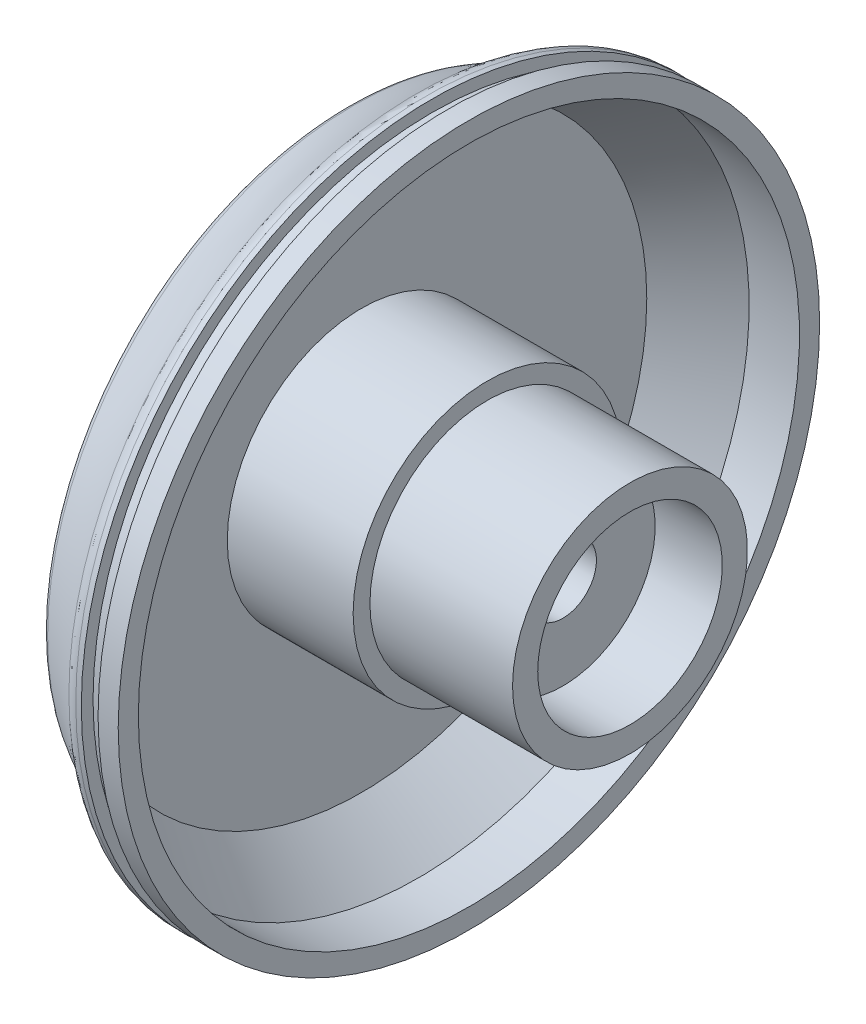
ISO-10303-21;
HEADER;
FILE_DESCRIPTION(('STEP AP214'),'2;1');
FILE_NAME('part.step','',(''),(''),'','','');
FILE_SCHEMA(('AUTOMOTIVE_DESIGN { 1 0 10303 214 1 1 1 1 }'));
ENDSEC;
DATA;
#1=APPLICATION_CONTEXT('core data for automotive mechanical design processes');
#2=APPLICATION_PROTOCOL_DEFINITION('international standard','automotive_design',2000,#1);
#3=PRODUCT_CONTEXT('',#1,'mechanical');
#4=PRODUCT('Part','Part','',(#3));
#5=PRODUCT_RELATED_PRODUCT_CATEGORY('part','',(#4));
#6=PRODUCT_DEFINITION_FORMATION('','',#4);
#7=PRODUCT_DEFINITION_CONTEXT('part definition',#1,'design');
#8=PRODUCT_DEFINITION('design','',#6,#7);
#9=PRODUCT_DEFINITION_SHAPE('','',#8);
#10=(LENGTH_UNIT() NAMED_UNIT(*) SI_UNIT(.MILLI.,.METRE.));
#11=(NAMED_UNIT(*) PLANE_ANGLE_UNIT() SI_UNIT($,.RADIAN.));
#12=(NAMED_UNIT(*) SI_UNIT($,.STERADIAN.) SOLID_ANGLE_UNIT());
#13=UNCERTAINTY_MEASURE_WITH_UNIT(LENGTH_MEASURE(1.E-05),#10,'distance_accuracy_value','');
#14=(GEOMETRIC_REPRESENTATION_CONTEXT(3) GLOBAL_UNCERTAINTY_ASSIGNED_CONTEXT((#13)) GLOBAL_UNIT_ASSIGNED_CONTEXT((#10,
#11,#12)) REPRESENTATION_CONTEXT('',''));
#15=CARTESIAN_POINT('',(0.,0.,0.));
#16=DIRECTION('',(0.,0.,1.));
#17=DIRECTION('',(1.,0.,0.));
#18=AXIS2_PLACEMENT_3D('',#15,#16,#17);
#19=CARTESIAN_POINT('',(170.,70.,0.));
#20=DIRECTION('',(-1.,0.,0.));
#21=DIRECTION('',(0.,0.,1.));
#22=AXIS2_PLACEMENT_3D('',#19,#20,#21);
#23=PLANE('',#22);
#24=CARTESIAN_POINT('',(170.,0.,0.));
#25=DIRECTION('',(-1.,0.,0.));
#26=DIRECTION('',(0.,0.,1.));
#27=AXIS2_PLACEMENT_3D('',#24,#25,#26);
#28=CIRCLE('',#27,70.);
#29=CARTESIAN_POINT('',(170.,0.,70.));
#30=VERTEX_POINT('',#29);
#31=EDGE_CURVE('E51',#30,#30,#28,.T.);
#32=ORIENTED_EDGE('',*,*,#31,.F.);
#33=EDGE_LOOP('',(#32));
#34=FACE_BOUND('',#33,.T.);
#35=CARTESIAN_POINT('',(170.,0.,0.));
#36=DIRECTION('',(-1.,0.,0.));
#37=DIRECTION('',(0.,0.,1.));
#38=AXIS2_PLACEMENT_3D('',#35,#36,#37);
#39=CIRCLE('',#38,55.);
#40=CARTESIAN_POINT('',(170.,0.,55.));
#41=VERTEX_POINT('',#40);
#42=EDGE_CURVE('E102',#41,#41,#39,.T.);
#43=ORIENTED_EDGE('',*,*,#42,.T.);
#44=EDGE_LOOP('',(#43));
#45=FACE_BOUND('',#44,.T.);
#46=ADVANCED_FACE('F31',(#34,#45),#23,.F.);
#47=CARTESIAN_POINT('',(0.,0.,0.));
#48=DIRECTION('',(-1.,0.,0.));
#49=DIRECTION('',(0.,0.,1.));
#50=AXIS2_PLACEMENT_3D('',#47,#48,#49);
#51=CYLINDRICAL_SURFACE('',#50,70.);
#52=CARTESIAN_POINT('',(85.,0.,0.));
#53=DIRECTION('',(-1.,0.,0.));
#54=DIRECTION('',(0.,0.,1.));
#55=AXIS2_PLACEMENT_3D('',#52,#53,#54);
#56=CIRCLE('',#55,70.);
#57=CARTESIAN_POINT('',(85.,0.,70.));
#58=VERTEX_POINT('',#57);
#59=EDGE_CURVE('E54',#58,#58,#56,.T.);
#60=ORIENTED_EDGE('',*,*,#59,.F.);
#61=EDGE_LOOP('',(#60));
#62=FACE_BOUND('',#61,.T.);
#63=ORIENTED_EDGE('',*,*,#31,.T.);
#64=EDGE_LOOP('',(#63));
#65=FACE_BOUND('',#64,.T.);
#66=ADVANCED_FACE('F149',(#62,#65),#51,.T.);
#67=CARTESIAN_POINT('',(85.,80.,0.));
#68=DIRECTION('',(-1.,0.,0.));
#69=DIRECTION('',(0.,0.,1.));
#70=AXIS2_PLACEMENT_3D('',#67,#68,#69);
#71=PLANE('',#70);
#72=CARTESIAN_POINT('',(85.,0.,0.));
#73=DIRECTION('',(-1.,0.,0.));
#74=DIRECTION('',(0.,0.,1.));
#75=AXIS2_PLACEMENT_3D('',#72,#73,#74);
#76=CIRCLE('',#75,80.);
#77=CARTESIAN_POINT('',(85.,0.,80.));
#78=VERTEX_POINT('',#77);
#79=EDGE_CURVE('E57',#78,#78,#76,.T.);
#80=ORIENTED_EDGE('',*,*,#79,.F.);
#81=EDGE_LOOP('',(#80));
#82=FACE_BOUND('',#81,.T.);
#83=ORIENTED_EDGE('',*,*,#59,.T.);
#84=EDGE_LOOP('',(#83));
#85=FACE_BOUND('',#84,.T.);
#86=ADVANCED_FACE('F155',(#82,#85),#71,.F.);
#87=CARTESIAN_POINT('',(0.,0.,0.));
#88=DIRECTION('',(-1.,0.,0.));
#89=DIRECTION('',(0.,0.,1.));
#90=AXIS2_PLACEMENT_3D('',#87,#88,#89);
#91=CYLINDRICAL_SURFACE('',#90,80.);
#92=CARTESIAN_POINT('',(10.,0.,0.));
#93=DIRECTION('',(-1.,0.,0.));
#94=DIRECTION('',(0.,0.,1.));
#95=AXIS2_PLACEMENT_3D('',#92,#93,#94);
#96=CIRCLE('',#95,80.);
#97=CARTESIAN_POINT('',(10.,0.,80.));
#98=VERTEX_POINT('',#97);
#99=EDGE_CURVE('E60',#98,#98,#96,.T.);
#100=ORIENTED_EDGE('',*,*,#99,.F.);
#101=EDGE_LOOP('',(#100));
#102=FACE_BOUND('',#101,.T.);
#103=ORIENTED_EDGE('',*,*,#79,.T.);
#104=EDGE_LOOP('',(#103));
#105=FACE_BOUND('',#104,.T.);
#106=ADVANCED_FACE('F305',(#102,#105),#91,.T.);
#107=CARTESIAN_POINT('',(10.,170.,0.));
#108=DIRECTION('',(-1.,0.,0.));
#109=DIRECTION('',(0.,0.,1.));
#110=AXIS2_PLACEMENT_3D('',#107,#108,#109);
#111=PLANE('',#110);
#112=CARTESIAN_POINT('',(9.99999999999999,0.,0.));
#113=DIRECTION('',(-1.,0.,0.));
#114=DIRECTION('',(0.,0.,1.));
#115=AXIS2_PLACEMENT_3D('',#112,#113,#114);
#116=CIRCLE('',#115,170.);
#117=CARTESIAN_POINT('',(9.99999999999999,0.,170.));
#118=VERTEX_POINT('',#117);
#119=EDGE_CURVE('E63',#118,#118,#116,.T.);
#120=ORIENTED_EDGE('',*,*,#119,.F.);
#121=EDGE_LOOP('',(#120));
#122=FACE_BOUND('',#121,.T.);
#123=ORIENTED_EDGE('',*,*,#99,.T.);
#124=EDGE_LOOP('',(#123));
#125=FACE_BOUND('',#124,.T.);
#126=ADVANCED_FACE('F295',(#122,#125),#111,.F.);
#127=CARTESIAN_POINT('',(9.99999999999999,0.,0.));
#128=DIRECTION('',(1.,0.,0.));
#129=DIRECTION('',(0.,0.,-1.));
#130=AXIS2_PLACEMENT_3D('',#127,#128,#129);
#131=CONICAL_SURFACE('',#130,170.,0.671143835436008);
#132=CARTESIAN_POINT('',(44.,0.,0.));
#133=DIRECTION('',(-1.,0.,0.));
#134=DIRECTION('',(0.,0.,1.));
#135=AXIS2_PLACEMENT_3D('',#132,#133,#134);
#136=CIRCLE('',#135,197.);
#137=CARTESIAN_POINT('',(44.,0.,197.));
#138=VERTEX_POINT('',#137);
#139=EDGE_CURVE('E66',#138,#138,#136,.T.);
#140=ORIENTED_EDGE('',*,*,#139,.F.);
#141=EDGE_LOOP('',(#140));
#142=FACE_BOUND('',#141,.T.);
#143=ORIENTED_EDGE('',*,*,#119,.T.);
#144=EDGE_LOOP('',(#143));
#145=FACE_BOUND('',#144,.T.);
#146=ADVANCED_FACE('F285',(#142,#145),#131,.F.);
#147=CARTESIAN_POINT('',(0.,0.,0.));
#148=DIRECTION('',(-1.,0.,0.));
#149=DIRECTION('',(0.,0.,1.));
#150=AXIS2_PLACEMENT_3D('',#147,#148,#149);
#151=CYLINDRICAL_SURFACE('',#150,197.);
#152=CARTESIAN_POINT('',(74.,0.,0.));
#153=DIRECTION('',(-1.,0.,0.));
#154=DIRECTION('',(0.,0.,1.));
#155=AXIS2_PLACEMENT_3D('',#152,#153,#154);
#156=CIRCLE('',#155,197.);
#157=CARTESIAN_POINT('',(74.,0.,197.));
#158=VERTEX_POINT('',#157);
#159=EDGE_CURVE('E69',#158,#158,#156,.T.);
#160=ORIENTED_EDGE('',*,*,#159,.F.);
#161=EDGE_LOOP('',(#160));
#162=FACE_BOUND('',#161,.T.);
#163=ORIENTED_EDGE('',*,*,#139,.T.);
#164=EDGE_LOOP('',(#163));
#165=FACE_BOUND('',#164,.T.);
#166=ADVANCED_FACE('F275',(#162,#165),#151,.F.);
#167=CARTESIAN_POINT('',(74.,209.,0.));
#168=DIRECTION('',(-1.,0.,0.));
#169=DIRECTION('',(0.,0.,1.));
#170=AXIS2_PLACEMENT_3D('',#167,#168,#169);
#171=PLANE('',#170);
#172=CARTESIAN_POINT('',(74.,0.,0.));
#173=DIRECTION('',(-1.,0.,0.));
#174=DIRECTION('',(0.,0.,1.));
#175=AXIS2_PLACEMENT_3D('',#172,#173,#174);
#176=CIRCLE('',#175,209.);
#177=CARTESIAN_POINT('',(74.,0.,209.));
#178=VERTEX_POINT('',#177);
#179=EDGE_CURVE('E72',#178,#178,#176,.T.);
#180=ORIENTED_EDGE('',*,*,#179,.F.);
#181=EDGE_LOOP('',(#180));
#182=FACE_BOUND('',#181,.T.);
#183=ORIENTED_EDGE('',*,*,#159,.T.);
#184=EDGE_LOOP('',(#183));
#185=FACE_BOUND('',#184,.T.);
#186=ADVANCED_FACE('F265',(#182,#185),#171,.F.);
#187=CARTESIAN_POINT('',(0.,0.,0.));
#188=DIRECTION('',(-1.,0.,0.));
#189=DIRECTION('',(0.,0.,1.));
#190=AXIS2_PLACEMENT_3D('',#187,#188,#189);
#191=CYLINDRICAL_SURFACE('',#190,209.);
#192=CARTESIAN_POINT('',(61.9999999999999,0.,0.));
#193=DIRECTION('',(-1.,0.,0.));
#194=DIRECTION('',(0.,0.,1.));
#195=AXIS2_PLACEMENT_3D('',#192,#193,#194);
#196=CIRCLE('',#195,209.);
#197=CARTESIAN_POINT('',(61.9999999999999,0.,209.));
#198=VERTEX_POINT('',#197);
#199=EDGE_CURVE('E75',#198,#198,#196,.T.);
#200=ORIENTED_EDGE('',*,*,#199,.F.);
#201=EDGE_LOOP('',(#200));
#202=FACE_BOUND('',#201,.T.);
#203=ORIENTED_EDGE('',*,*,#179,.T.);
#204=EDGE_LOOP('',(#203));
#205=FACE_BOUND('',#204,.T.);
#206=ADVANCED_FACE('F255',(#202,#205),#191,.T.);
#207=CARTESIAN_POINT('',(61.9999999999999,209.,0.));
#208=DIRECTION('',(1.,0.,0.));
#209=DIRECTION('',(0.,0.,-1.));
#210=AXIS2_PLACEMENT_3D('',#207,#208,#209);
#211=PLANE('',#210);
#212=CARTESIAN_POINT('',(61.9999999999999,0.,0.));
#213=DIRECTION('',(-1.,0.,0.));
#214=DIRECTION('',(0.,0.,1.));
#215=AXIS2_PLACEMENT_3D('',#212,#213,#214);
#216=CIRCLE('',#215,202.);
#217=CARTESIAN_POINT('',(61.9999999999999,0.,202.));
#218=VERTEX_POINT('',#217);
#219=EDGE_CURVE('E78',#218,#218,#216,.T.);
#220=ORIENTED_EDGE('',*,*,#219,.F.);
#221=EDGE_LOOP('',(#220));
#222=FACE_BOUND('',#221,.T.);
#223=ORIENTED_EDGE('',*,*,#199,.T.);
#224=EDGE_LOOP('',(#223));
#225=FACE_BOUND('',#224,.T.);
#226=ADVANCED_FACE('F245',(#222,#225),#211,.F.);
#227=CARTESIAN_POINT('',(0.,0.,0.));
#228=DIRECTION('',(-1.,0.,0.));
#229=DIRECTION('',(0.,0.,1.));
#230=AXIS2_PLACEMENT_3D('',#227,#228,#229);
#231=CYLINDRICAL_SURFACE('',#230,202.);
#232=CARTESIAN_POINT('',(51.9999999999999,0.,0.));
#233=DIRECTION('',(-1.,0.,0.));
#234=DIRECTION('',(0.,0.,1.));
#235=AXIS2_PLACEMENT_3D('',#232,#233,#234);
#236=CIRCLE('',#235,202.);
#237=CARTESIAN_POINT('',(51.9999999999999,0.,202.));
#238=VERTEX_POINT('',#237);
#239=EDGE_CURVE('E81',#238,#238,#236,.T.);
#240=ORIENTED_EDGE('',*,*,#239,.F.);
#241=EDGE_LOOP('',(#240));
#242=FACE_BOUND('',#241,.T.);
#243=ORIENTED_EDGE('',*,*,#219,.T.);
#244=EDGE_LOOP('',(#243));
#245=FACE_BOUND('',#244,.T.);
#246=ADVANCED_FACE('F235',(#242,#245),#231,.T.);
#247=CARTESIAN_POINT('',(51.9999999999999,209.,0.));
#248=DIRECTION('',(-1.,0.,0.));
#249=DIRECTION('',(0.,0.,1.));
#250=AXIS2_PLACEMENT_3D('',#247,#248,#249);
#251=PLANE('',#250);
#252=CARTESIAN_POINT('',(51.9999999999999,0.,0.));
#253=DIRECTION('',(-1.,0.,0.));
#254=DIRECTION('',(0.,0.,1.));
#255=AXIS2_PLACEMENT_3D('',#252,#253,#254);
#256=CIRCLE('',#255,209.);
#257=CARTESIAN_POINT('',(51.9999999999999,0.,209.));
#258=VERTEX_POINT('',#257);
#259=EDGE_CURVE('E84',#258,#258,#256,.T.);
#260=ORIENTED_EDGE('',*,*,#259,.F.);
#261=EDGE_LOOP('',(#260));
#262=FACE_BOUND('',#261,.T.);
#263=ORIENTED_EDGE('',*,*,#239,.T.);
#264=EDGE_LOOP('',(#263));
#265=FACE_BOUND('',#264,.T.);
#266=ADVANCED_FACE('F198',(#262,#265),#251,.F.);
#267=CARTESIAN_POINT('',(0.,0.,0.));
#268=DIRECTION('',(-1.,0.,0.));
#269=DIRECTION('',(0.,0.,1.));
#270=AXIS2_PLACEMENT_3D('',#267,#268,#269);
#271=CYLINDRICAL_SURFACE('',#270,209.);
#272=CARTESIAN_POINT('',(48.7054664370741,0.,0.));
#273=DIRECTION('',(1.,0.,0.));
#274=DIRECTION('',(0.,0.,-1.));
#275=AXIS2_PLACEMENT_3D('',#272,#273,#274);
#276=CIRCLE('',#275,209.);
#277=CARTESIAN_POINT('',(48.7054664370741,0.,-209.));
#278=VERTEX_POINT('',#277);
#279=EDGE_CURVE('E38',#278,#278,#276,.T.);
#280=ORIENTED_EDGE('',*,*,#279,.T.);
#281=EDGE_LOOP('',(#280));
#282=FACE_BOUND('',#281,.T.);
#283=ORIENTED_EDGE('',*,*,#259,.T.);
#284=EDGE_LOOP('',(#283));
#285=FACE_BOUND('',#284,.T.);
#286=ADVANCED_FACE('F145',(#282,#285),#271,.T.);
#287=CARTESIAN_POINT('',(-75.2365822939019,0.,0.));
#288=DIRECTION('',(-1.,0.,0.));
#289=DIRECTION('',(0.,0.,1.));
#290=AXIS2_PLACEMENT_3D('',#287,#288,#289);
#291=TOROIDAL_SURFACE('',#290,346.160213904331,182.4);
#292=CARTESIAN_POINT('',(42.2635720123872,0.,0.));
#293=DIRECTION('',(-1.,0.,0.));
#294=DIRECTION('',(0.,0.,1.));
#295=AXIS2_PLACEMENT_3D('',#292,#293,#294);
#296=CIRCLE('',#295,206.648659766337);
#297=CARTESIAN_POINT('',(42.2635720123872,0.,206.648659766337));
#298=VERTEX_POINT('',#297);
#299=EDGE_CURVE('E42',#298,#298,#296,.T.);
#300=ORIENTED_EDGE('',*,*,#299,.T.);
#301=EDGE_LOOP('',(#300));
#302=FACE_BOUND('',#301,.T.);
#303=CARTESIAN_POINT('',(5.56982420509868,0.,0.));
#304=DIRECTION('',(-1.,0.,0.));
#305=DIRECTION('',(0.,0.,1.));
#306=AXIS2_PLACEMENT_3D('',#303,#304,#305);
#307=CIRCLE('',#306,182.636256428008);
#308=CARTESIAN_POINT('',(5.56982420509868,0.,182.636256428008));
#309=VERTEX_POINT('',#308);
#310=EDGE_CURVE('E46',#309,#309,#307,.F.);
#311=ORIENTED_EDGE('',*,*,#310,.T.);
#312=EDGE_LOOP('',(#311));
#313=FACE_BOUND('',#312,.T.);
#314=ADVANCED_FACE('F140',(#302,#313),#291,.F.);
#315=CARTESIAN_POINT('',(0.,55.,0.));
#316=DIRECTION('',(1.,0.,0.));
#317=DIRECTION('',(0.,0.,-1.));
#318=AXIS2_PLACEMENT_3D('',#315,#316,#317);
#319=PLANE('',#318);
#320=CARTESIAN_POINT('',(0.,0.,0.));
#321=DIRECTION('',(1.,0.,0.));
#322=DIRECTION('',(0.,0.,-1.));
#323=AXIS2_PLACEMENT_3D('',#320,#321,#322);
#324=CIRCLE('',#323,173.671127180402);
#325=CARTESIAN_POINT('',(0.,0.,-173.671127180402));
#326=VERTEX_POINT('',#325);
#327=EDGE_CURVE('E10',#326,#326,#324,.F.);
#328=ORIENTED_EDGE('',*,*,#327,.T.);
#329=EDGE_LOOP('',(#328));
#330=FACE_BOUND('',#329,.T.);
#331=CARTESIAN_POINT('',(0.,0.,0.));
#332=DIRECTION('',(-1.,0.,0.));
#333=DIRECTION('',(0.,0.,1.));
#334=AXIS2_PLACEMENT_3D('',#331,#332,#333);
#335=CIRCLE('',#334,55.);
#336=CARTESIAN_POINT('',(0.,0.,55.));
#337=VERTEX_POINT('',#336);
#338=EDGE_CURVE('E87',#337,#337,#335,.T.);
#339=ORIENTED_EDGE('',*,*,#338,.F.);
#340=EDGE_LOOP('',(#339));
#341=FACE_BOUND('',#340,.T.);
#342=ADVANCED_FACE('F135',(#330,#341),#319,.F.);
#343=CARTESIAN_POINT('',(0.,0.,0.));
#344=DIRECTION('',(-1.,0.,0.));
#345=DIRECTION('',(0.,0.,1.));
#346=AXIS2_PLACEMENT_3D('',#343,#344,#345);
#347=CYLINDRICAL_SURFACE('',#346,55.);
#348=CARTESIAN_POINT('',(40.,0.,0.));
#349=DIRECTION('',(-1.,0.,0.));
#350=DIRECTION('',(0.,0.,1.));
#351=AXIS2_PLACEMENT_3D('',#348,#349,#350);
#352=CIRCLE('',#351,55.);
#353=CARTESIAN_POINT('',(40.,0.,55.));
#354=VERTEX_POINT('',#353);
#355=EDGE_CURVE('E90',#354,#354,#352,.T.);
#356=ORIENTED_EDGE('',*,*,#355,.F.);
#357=EDGE_LOOP('',(#356));
#358=FACE_BOUND('',#357,.T.);
#359=ORIENTED_EDGE('',*,*,#338,.T.);
#360=EDGE_LOOP('',(#359));
#361=FACE_BOUND('',#360,.T.);
#362=ADVANCED_FACE('F129',(#358,#361),#347,.F.);
#363=CARTESIAN_POINT('',(40.,20.,0.));
#364=DIRECTION('',(1.,0.,0.));
#365=DIRECTION('',(0.,0.,-1.));
#366=AXIS2_PLACEMENT_3D('',#363,#364,#365);
#367=PLANE('',#366);
#368=CARTESIAN_POINT('',(40.,0.,0.));
#369=DIRECTION('',(-1.,0.,0.));
#370=DIRECTION('',(0.,0.,1.));
#371=AXIS2_PLACEMENT_3D('',#368,#369,#370);
#372=CIRCLE('',#371,20.);
#373=CARTESIAN_POINT('',(40.,0.,20.));
#374=VERTEX_POINT('',#373);
#375=EDGE_CURVE('E93',#374,#374,#372,.T.);
#376=ORIENTED_EDGE('',*,*,#375,.F.);
#377=EDGE_LOOP('',(#376));
#378=FACE_BOUND('',#377,.T.);
#379=ORIENTED_EDGE('',*,*,#355,.T.);
#380=EDGE_LOOP('',(#379));
#381=FACE_BOUND('',#380,.T.);
#382=ADVANCED_FACE('F123',(#378,#381),#367,.F.);
#383=CARTESIAN_POINT('',(0.,0.,0.));
#384=DIRECTION('',(-1.,0.,0.));
#385=DIRECTION('',(0.,0.,1.));
#386=AXIS2_PLACEMENT_3D('',#383,#384,#385);
#387=CYLINDRICAL_SURFACE('',#386,20.);
#388=CARTESIAN_POINT('',(130.,0.,0.));
#389=DIRECTION('',(-1.,0.,0.));
#390=DIRECTION('',(0.,0.,1.));
#391=AXIS2_PLACEMENT_3D('',#388,#389,#390);
#392=CIRCLE('',#391,20.);
#393=CARTESIAN_POINT('',(130.,0.,20.));
#394=VERTEX_POINT('',#393);
#395=EDGE_CURVE('E96',#394,#394,#392,.T.);
#396=ORIENTED_EDGE('',*,*,#395,.F.);
#397=EDGE_LOOP('',(#396));
#398=FACE_BOUND('',#397,.T.);
#399=ORIENTED_EDGE('',*,*,#375,.T.);
#400=EDGE_LOOP('',(#399));
#401=FACE_BOUND('',#400,.T.);
#402=ADVANCED_FACE('F117',(#398,#401),#387,.F.);
#403=CARTESIAN_POINT('',(130.,55.,0.));
#404=DIRECTION('',(-1.,0.,0.));
#405=DIRECTION('',(0.,0.,1.));
#406=AXIS2_PLACEMENT_3D('',#403,#404,#405);
#407=PLANE('',#406);
#408=CARTESIAN_POINT('',(130.,0.,0.));
#409=DIRECTION('',(-1.,0.,0.));
#410=DIRECTION('',(0.,0.,1.));
#411=AXIS2_PLACEMENT_3D('',#408,#409,#410);
#412=CIRCLE('',#411,55.);
#413=CARTESIAN_POINT('',(130.,0.,55.));
#414=VERTEX_POINT('',#413);
#415=EDGE_CURVE('E99',#414,#414,#412,.T.);
#416=ORIENTED_EDGE('',*,*,#415,.F.);
#417=EDGE_LOOP('',(#416));
#418=FACE_BOUND('',#417,.T.);
#419=ORIENTED_EDGE('',*,*,#395,.T.);
#420=EDGE_LOOP('',(#419));
#421=FACE_BOUND('',#420,.T.);
#422=ADVANCED_FACE('F111',(#418,#421),#407,.F.);
#423=CARTESIAN_POINT('',(0.,0.,0.));
#424=DIRECTION('',(-1.,0.,0.));
#425=DIRECTION('',(0.,0.,1.));
#426=AXIS2_PLACEMENT_3D('',#423,#424,#425);
#427=CYLINDRICAL_SURFACE('',#426,55.);
#428=ORIENTED_EDGE('',*,*,#42,.F.);
#429=EDGE_LOOP('',(#428));
#430=FACE_BOUND('',#429,.T.);
#431=ORIENTED_EDGE('',*,*,#415,.T.);
#432=EDGE_LOOP('',(#431));
#433=FACE_BOUND('',#432,.T.);
#434=ADVANCED_FACE('F107',(#430,#433),#427,.F.);
#435=CARTESIAN_POINT('',(48.7054664370741,0.,0.));
#436=DIRECTION('',(1.,0.,0.));
#437=DIRECTION('',(0.,0.,-1.));
#438=AXIS2_PLACEMENT_3D('',#435,#436,#437);
#439=TOROIDAL_SURFACE('',#438,199.,10.);
#440=ORIENTED_EDGE('',*,*,#279,.F.);
#441=EDGE_LOOP('',(#440));
#442=FACE_BOUND('',#441,.T.);
#443=ORIENTED_EDGE('',*,*,#299,.F.);
#444=EDGE_LOOP('',(#443));
#445=FACE_BOUND('',#444,.T.);
#446=ADVANCED_FACE('F110',(#442,#445),#439,.T.);
#447=CARTESIAN_POINT('',(10.,0.,0.));
#448=DIRECTION('',(-1.,0.,0.));
#449=DIRECTION('',(0.,0.,1.));
#450=AXIS2_PLACEMENT_3D('',#447,#448,#449);
#451=TOROIDAL_SURFACE('',#450,173.671127180402,10.);
#452=ORIENTED_EDGE('',*,*,#310,.F.);
#453=EDGE_LOOP('',(#452));
#454=FACE_BOUND('',#453,.T.);
#455=ORIENTED_EDGE('',*,*,#327,.F.);
#456=EDGE_LOOP('',(#455));
#457=FACE_BOUND('',#456,.T.);
#458=ADVANCED_FACE('F33',(#454,#457),#451,.T.);
#459=CLOSED_SHELL('',(#46,#66,#86,#106,#126,#146,#166,#186,#206,#226,#246,#266,#286,#314,#342,
#362,#382,#402,#422,#434,#446,#458));
#460=MANIFOLD_SOLID_BREP('B2',#459);
#461=ADVANCED_BREP_SHAPE_REPRESENTATION('',(#18,#460),#14);
#462=SHAPE_DEFINITION_REPRESENTATION(#9,#461);
ENDSEC;
END-ISO-10303-21;
